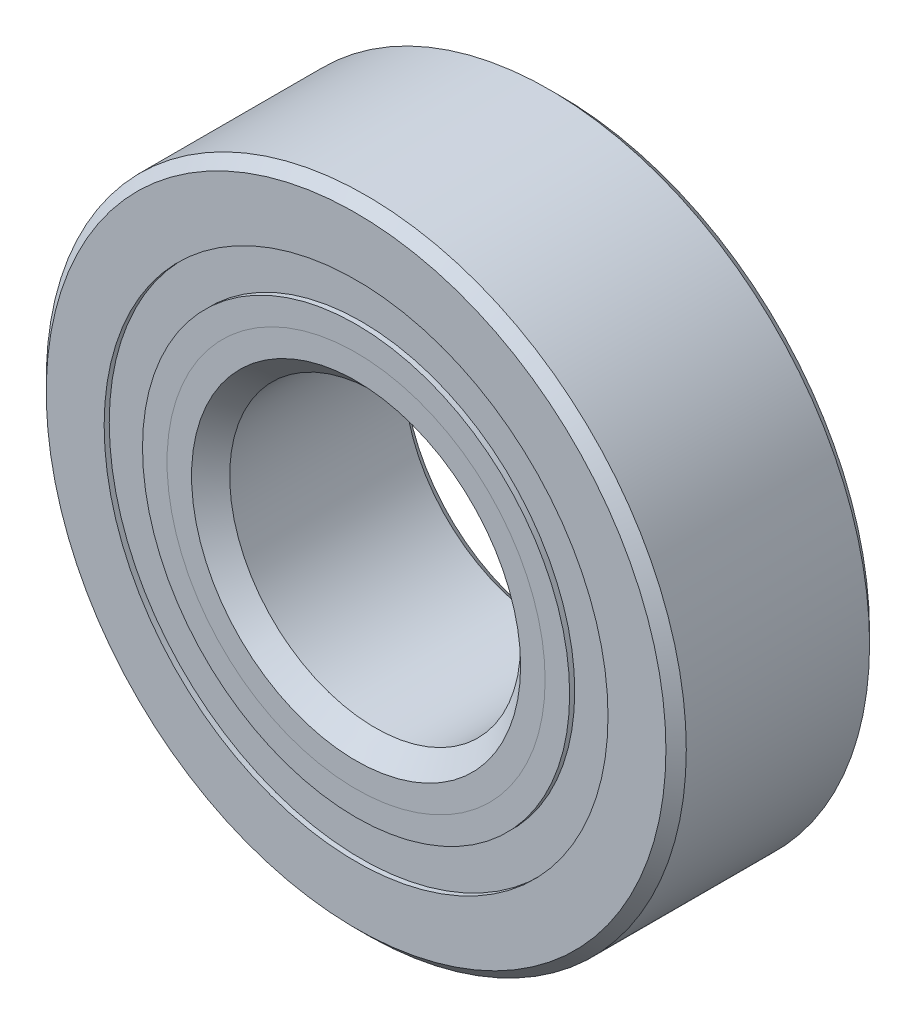
ISO-10303-21;
HEADER;
FILE_DESCRIPTION(('STEP AP214'),'2;1');
FILE_NAME('part.step','',(''),(''),'','','');
FILE_SCHEMA(('AUTOMOTIVE_DESIGN { 1 0 10303 214 1 1 1 1 }'));
ENDSEC;
DATA;
#1=APPLICATION_CONTEXT('core data for automotive mechanical design processes');
#2=APPLICATION_PROTOCOL_DEFINITION('international standard','automotive_design',2000,#1);
#3=PRODUCT_CONTEXT('',#1,'mechanical');
#4=PRODUCT('Part','Part','',(#3));
#5=PRODUCT_RELATED_PRODUCT_CATEGORY('part','',(#4));
#6=PRODUCT_DEFINITION_FORMATION('','',#4);
#7=PRODUCT_DEFINITION_CONTEXT('part definition',#1,'design');
#8=PRODUCT_DEFINITION('design','',#6,#7);
#9=PRODUCT_DEFINITION_SHAPE('','',#8);
#10=(LENGTH_UNIT() NAMED_UNIT(*) SI_UNIT(.MILLI.,.METRE.));
#11=(NAMED_UNIT(*) PLANE_ANGLE_UNIT() SI_UNIT($,.RADIAN.));
#12=(NAMED_UNIT(*) SI_UNIT($,.STERADIAN.) SOLID_ANGLE_UNIT());
#13=UNCERTAINTY_MEASURE_WITH_UNIT(LENGTH_MEASURE(1.E-05),#10,'distance_accuracy_value','');
#14=(GEOMETRIC_REPRESENTATION_CONTEXT(3) GLOBAL_UNCERTAINTY_ASSIGNED_CONTEXT((#13)) GLOBAL_UNIT_ASSIGNED_CONTEXT((#10,
#11,#12)) REPRESENTATION_CONTEXT('',''));
#15=CARTESIAN_POINT('',(0.,0.,0.));
#16=DIRECTION('',(0.,0.,1.));
#17=DIRECTION('',(1.,0.,0.));
#18=AXIS2_PLACEMENT_3D('',#15,#16,#17);
#19=CARTESIAN_POINT('',(0.,13.7467032967033,-5.2784375));
#20=DIRECTION('',(0.,0.,1.));
#21=DIRECTION('',(1.,0.,0.));
#22=AXIS2_PLACEMENT_3D('',#19,#20,#21);
#23=PLANE('',#22);
#24=CARTESIAN_POINT('',(0.,0.,-5.2784375));
#25=DIRECTION('',(0.,0.,1.));
#26=DIRECTION('',(1.,0.,0.));
#27=AXIS2_PLACEMENT_3D('',#24,#25,#26);
#28=CIRCLE('',#27,13.7467032967033);
#29=CARTESIAN_POINT('',(13.7467032967033,0.,-5.2784375));
#30=VERTEX_POINT('',#29);
#31=EDGE_CURVE('E56',#30,#30,#28,.T.);
#32=ORIENTED_EDGE('',*,*,#31,.F.);
#33=EDGE_LOOP('',(#32));
#34=FACE_BOUND('',#33,.T.);
#35=CARTESIAN_POINT('',(0.,0.,-5.2784375));
#36=DIRECTION('',(0.,0.,1.));
#37=DIRECTION('',(1.,0.,0.));
#38=AXIS2_PLACEMENT_3D('',#35,#36,#37);
#39=CIRCLE('',#38,11.6532967032967);
#40=CARTESIAN_POINT('',(11.6532967032967,0.,-5.2784375));
#41=VERTEX_POINT('',#40);
#42=EDGE_CURVE('E11',#41,#41,#39,.T.);
#43=ORIENTED_EDGE('',*,*,#42,.T.);
#44=EDGE_LOOP('',(#43));
#45=FACE_BOUND('',#44,.T.);
#46=ADVANCED_FACE('F42',(#34,#45),#23,.F.);
#47=CARTESIAN_POINT('',(0.,0.,5.55625));
#48=DIRECTION('',(0.,0.,1.));
#49=DIRECTION('',(1.,0.,0.));
#50=AXIS2_PLACEMENT_3D('',#47,#48,#49);
#51=CYLINDRICAL_SURFACE('',#50,11.6532967032967);
#52=ORIENTED_EDGE('',*,*,#42,.F.);
#53=EDGE_LOOP('',(#52));
#54=FACE_BOUND('',#53,.T.);
#55=CARTESIAN_POINT('',(0.,0.,-2.68211551867683));
#56=DIRECTION('',(0.,0.,1.));
#57=DIRECTION('',(1.,0.,0.));
#58=AXIS2_PLACEMENT_3D('',#55,#56,#57);
#59=CIRCLE('',#58,11.6532967032967);
#60=CARTESIAN_POINT('',(11.6532967032967,0.,-2.68211551867683));
#61=VERTEX_POINT('',#60);
#62=EDGE_CURVE('E48',#61,#61,#59,.T.);
#63=ORIENTED_EDGE('',*,*,#62,.T.);
#64=EDGE_LOOP('',(#63));
#65=FACE_BOUND('',#64,.T.);
#66=ADVANCED_FACE('F65',(#54,#65),#51,.F.);
#67=CARTESIAN_POINT('',(0.,13.7467032967033,-2.68211551867683));
#68=DIRECTION('',(0.,0.,-1.));
#69=DIRECTION('',(-1.,0.,0.));
#70=AXIS2_PLACEMENT_3D('',#67,#68,#69);
#71=PLANE('',#70);
#72=ORIENTED_EDGE('',*,*,#62,.F.);
#73=EDGE_LOOP('',(#72));
#74=FACE_BOUND('',#73,.T.);
#75=CARTESIAN_POINT('',(0.,0.,-2.68211551867683));
#76=DIRECTION('',(0.,0.,1.));
#77=DIRECTION('',(1.,0.,0.));
#78=AXIS2_PLACEMENT_3D('',#75,#76,#77);
#79=CIRCLE('',#78,13.7467032967033);
#80=CARTESIAN_POINT('',(13.7467032967033,0.,-2.68211551867683));
#81=VERTEX_POINT('',#80);
#82=EDGE_CURVE('E52',#81,#81,#79,.T.);
#83=ORIENTED_EDGE('',*,*,#82,.T.);
#84=EDGE_LOOP('',(#83));
#85=FACE_BOUND('',#84,.T.);
#86=ADVANCED_FACE('F69',(#74,#85),#71,.F.);
#87=CARTESIAN_POINT('',(0.,0.,5.55625));
#88=DIRECTION('',(0.,0.,1.));
#89=DIRECTION('',(1.,0.,0.));
#90=AXIS2_PLACEMENT_3D('',#87,#88,#89);
#91=CYLINDRICAL_SURFACE('',#90,13.7467032967033);
#92=ORIENTED_EDGE('',*,*,#82,.F.);
#93=EDGE_LOOP('',(#92));
#94=FACE_BOUND('',#93,.T.);
#95=ORIENTED_EDGE('',*,*,#31,.T.);
#96=EDGE_LOOP('',(#95));
#97=FACE_BOUND('',#96,.T.);
#98=ADVANCED_FACE('F62',(#94,#97),#91,.T.);
#99=CLOSED_SHELL('',(#46,#66,#86,#98));
#100=MANIFOLD_SOLID_BREP('B2',#99);
#101=CARTESIAN_POINT('',(0.,13.7467032967033,5.2784375));
#102=DIRECTION('',(0.,0.,-1.));
#103=DIRECTION('',(-1.,0.,0.));
#104=AXIS2_PLACEMENT_3D('',#101,#102,#103);
#105=PLANE('',#104);
#106=CARTESIAN_POINT('',(0.,0.,5.2784375));
#107=DIRECTION('',(0.,0.,1.));
#108=DIRECTION('',(1.,0.,0.));
#109=AXIS2_PLACEMENT_3D('',#106,#107,#108);
#110=CIRCLE('',#109,11.6532967032967);
#111=CARTESIAN_POINT('',(11.6532967032967,0.,5.2784375));
#112=VERTEX_POINT('',#111);
#113=EDGE_CURVE('E41',#112,#112,#110,.T.);
#114=ORIENTED_EDGE('',*,*,#113,.F.);
#115=EDGE_LOOP('',(#114));
#116=FACE_BOUND('',#115,.T.);
#117=CARTESIAN_POINT('',(0.,0.,5.2784375));
#118=DIRECTION('',(0.,0.,1.));
#119=DIRECTION('',(1.,0.,0.));
#120=AXIS2_PLACEMENT_3D('',#117,#118,#119);
#121=CIRCLE('',#120,13.7467032967033);
#122=CARTESIAN_POINT('',(13.7467032967033,0.,5.2784375));
#123=VERTEX_POINT('',#122);
#124=EDGE_CURVE('E124',#123,#123,#121,.T.);
#125=ORIENTED_EDGE('',*,*,#124,.T.);
#126=EDGE_LOOP('',(#125));
#127=FACE_BOUND('',#126,.T.);
#128=ADVANCED_FACE('F110',(#116,#127),#105,.F.);
#129=CARTESIAN_POINT('',(0.,0.,5.55625));
#130=DIRECTION('',(0.,0.,1.));
#131=DIRECTION('',(1.,0.,0.));
#132=AXIS2_PLACEMENT_3D('',#129,#130,#131);
#133=CYLINDRICAL_SURFACE('',#132,11.6532967032967);
#134=CARTESIAN_POINT('',(0.,0.,2.68211551867683));
#135=DIRECTION('',(0.,0.,1.));
#136=DIRECTION('',(1.,0.,0.));
#137=AXIS2_PLACEMENT_3D('',#134,#135,#136);
#138=CIRCLE('',#137,11.6532967032967);
#139=CARTESIAN_POINT('',(11.6532967032967,0.,2.68211551867683));
#140=VERTEX_POINT('',#139);
#141=EDGE_CURVE('E116',#140,#140,#138,.T.);
#142=ORIENTED_EDGE('',*,*,#141,.F.);
#143=EDGE_LOOP('',(#142));
#144=FACE_BOUND('',#143,.T.);
#145=ORIENTED_EDGE('',*,*,#113,.T.);
#146=EDGE_LOOP('',(#145));
#147=FACE_BOUND('',#146,.T.);
#148=ADVANCED_FACE('F139',(#144,#147),#133,.F.);
#149=CARTESIAN_POINT('',(0.,13.7467032967033,2.68211551867683));
#150=DIRECTION('',(0.,0.,1.));
#151=DIRECTION('',(1.,0.,0.));
#152=AXIS2_PLACEMENT_3D('',#149,#150,#151);
#153=PLANE('',#152);
#154=CARTESIAN_POINT('',(0.,0.,2.68211551867683));
#155=DIRECTION('',(0.,0.,1.));
#156=DIRECTION('',(1.,0.,0.));
#157=AXIS2_PLACEMENT_3D('',#154,#155,#156);
#158=CIRCLE('',#157,13.7467032967033);
#159=CARTESIAN_POINT('',(13.7467032967033,0.,2.68211551867683));
#160=VERTEX_POINT('',#159);
#161=EDGE_CURVE('E120',#160,#160,#158,.T.);
#162=ORIENTED_EDGE('',*,*,#161,.F.);
#163=EDGE_LOOP('',(#162));
#164=FACE_BOUND('',#163,.T.);
#165=ORIENTED_EDGE('',*,*,#141,.T.);
#166=EDGE_LOOP('',(#165));
#167=FACE_BOUND('',#166,.T.);
#168=ADVANCED_FACE('F134',(#164,#167),#153,.F.);
#169=CARTESIAN_POINT('',(0.,0.,5.55625));
#170=DIRECTION('',(0.,0.,1.));
#171=DIRECTION('',(1.,0.,0.));
#172=AXIS2_PLACEMENT_3D('',#169,#170,#171);
#173=CYLINDRICAL_SURFACE('',#172,13.7467032967033);
#174=ORIENTED_EDGE('',*,*,#124,.F.);
#175=EDGE_LOOP('',(#174));
#176=FACE_BOUND('',#175,.T.);
#177=ORIENTED_EDGE('',*,*,#161,.T.);
#178=EDGE_LOOP('',(#177));
#179=FACE_BOUND('',#178,.T.);
#180=ADVANCED_FACE('F131',(#176,#179),#173,.T.);
#181=CLOSED_SHELL('',(#128,#148,#168,#180));
#182=MANIFOLD_SOLID_BREP('B6',#181);
#183=CARTESIAN_POINT('',(-6.34999999999986,10.9985226280625,0.));
#184=DIRECTION('',(0.,0.,1.));
#185=DIRECTION('',(-0.499999999999989,0.866025403784445,0.));
#186=AXIS2_PLACEMENT_3D('',#183,#184,#185);
#187=SPHERICAL_SURFACE('',#186,2.68211551867683);
#188=CARTESIAN_POINT('',(-6.34999999999986,10.9985226280625,2.68211551867683));
#189=VERTEX_POINT('',#188);
#190=VERTEX_LOOP('',#189);
#191=FACE_BOUND('',#190,.T.);
#192=ADVANCED_FACE('F179',(#191),#187,.T.);
#193=CLOSED_SHELL('',(#192));
#194=MANIFOLD_SOLID_BREP('B36',#193);
#195=CARTESIAN_POINT('',(-10.9985226280623,6.35000000000013,0.));
#196=DIRECTION('',(0.,0.,1.));
#197=DIRECTION('',(-0.866025403784433,0.50000000000001,0.));
#198=AXIS2_PLACEMENT_3D('',#195,#196,#197);
#199=SPHERICAL_SURFACE('',#198,2.68211551867683);
#200=CARTESIAN_POINT('',(-10.9985226280623,6.35000000000013,2.68211551867683));
#201=VERTEX_POINT('',#200);
#202=VERTEX_LOOP('',#201);
#203=FACE_BOUND('',#202,.T.);
#204=ADVANCED_FACE('F200',(#203),#199,.T.);
#205=CLOSED_SHELL('',(#204));
#206=MANIFOLD_SOLID_BREP('B106',#205);
#207=CARTESIAN_POINT('',(-12.7,1.33025516058267E-13,0.));
#208=DIRECTION('',(0.,0.,1.));
#209=DIRECTION('',(-1.,0.,0.));
#210=AXIS2_PLACEMENT_3D('',#207,#208,#209);
#211=SPHERICAL_SURFACE('',#210,2.68211551867683);
#212=CARTESIAN_POINT('',(-12.7,1.33025516058267E-13,2.68211551867683));
#213=VERTEX_POINT('',#212);
#214=VERTEX_LOOP('',#213);
#215=FACE_BOUND('',#214,.T.);
#216=ADVANCED_FACE('F221',(#215),#211,.T.);
#217=CLOSED_SHELL('',(#216));
#218=MANIFOLD_SOLID_BREP('B175',#217);
#219=CARTESIAN_POINT('',(-10.9985226280624,-6.3499999999999,0.));
#220=DIRECTION('',(0.,0.,1.));
#221=DIRECTION('',(-0.866025403784443,-0.499999999999992,0.));
#222=AXIS2_PLACEMENT_3D('',#219,#220,#221);
#223=SPHERICAL_SURFACE('',#222,2.68211551867683);
#224=CARTESIAN_POINT('',(-10.9985226280624,-6.3499999999999,2.68211551867683));
#225=VERTEX_POINT('',#224);
#226=VERTEX_LOOP('',#225);
#227=FACE_BOUND('',#226,.T.);
#228=ADVANCED_FACE('F242',(#227),#223,.T.);
#229=CLOSED_SHELL('',(#228));
#230=MANIFOLD_SOLID_BREP('B196',#229);
#231=CARTESIAN_POINT('',(-6.35000000000009,-10.9985226280623,0.));
#232=DIRECTION('',(0.,0.,1.));
#233=DIRECTION('',(-0.500000000000007,-0.866025403784435,0.));
#234=AXIS2_PLACEMENT_3D('',#231,#232,#233);
#235=SPHERICAL_SURFACE('',#234,2.68211551867683);
#236=CARTESIAN_POINT('',(-6.35000000000009,-10.9985226280623,2.68211551867683));
#237=VERTEX_POINT('',#236);
#238=VERTEX_LOOP('',#237);
#239=FACE_BOUND('',#238,.T.);
#240=ADVANCED_FACE('F263',(#239),#235,.T.);
#241=CLOSED_SHELL('',(#240));
#242=MANIFOLD_SOLID_BREP('B217',#241);
#243=CARTESIAN_POINT('',(0.,-12.7,0.));
#244=DIRECTION('',(0.,0.,1.));
#245=DIRECTION('',(0.,-1.,0.));
#246=AXIS2_PLACEMENT_3D('',#243,#244,#245);
#247=SPHERICAL_SURFACE('',#246,2.68211551867683);
#248=CARTESIAN_POINT('',(0.,-12.7,2.68211551867683));
#249=VERTEX_POINT('',#248);
#250=VERTEX_LOOP('',#249);
#251=FACE_BOUND('',#250,.T.);
#252=ADVANCED_FACE('F284',(#251),#247,.T.);
#253=CLOSED_SHELL('',(#252));
#254=MANIFOLD_SOLID_BREP('B238',#253);
#255=CARTESIAN_POINT('',(6.34999999999994,-10.9985226280624,0.));
#256=DIRECTION('',(0.,0.,1.));
#257=DIRECTION('',(0.499999999999995,-0.866025403784442,0.));
#258=AXIS2_PLACEMENT_3D('',#255,#256,#257);
#259=SPHERICAL_SURFACE('',#258,2.68211551867683);
#260=CARTESIAN_POINT('',(6.34999999999994,-10.9985226280624,2.68211551867683));
#261=VERTEX_POINT('',#260);
#262=VERTEX_LOOP('',#261);
#263=FACE_BOUND('',#262,.T.);
#264=ADVANCED_FACE('F305',(#263),#259,.T.);
#265=CLOSED_SHELL('',(#264));
#266=MANIFOLD_SOLID_BREP('B259',#265);
#267=CARTESIAN_POINT('',(10.9985226280623,-6.35000000000005,0.));
#268=DIRECTION('',(0.,0.,1.));
#269=DIRECTION('',(0.866025403784436,-0.500000000000004,0.));
#270=AXIS2_PLACEMENT_3D('',#267,#268,#269);
#271=SPHERICAL_SURFACE('',#270,2.68211551867683);
#272=CARTESIAN_POINT('',(10.9985226280623,-6.35000000000005,2.68211551867683));
#273=VERTEX_POINT('',#272);
#274=VERTEX_LOOP('',#273);
#275=FACE_BOUND('',#274,.T.);
#276=ADVANCED_FACE('F326',(#275),#271,.T.);
#277=CLOSED_SHELL('',(#276));
#278=MANIFOLD_SOLID_BREP('B280',#277);
#279=CARTESIAN_POINT('',(12.7,0.,0.));
#280=DIRECTION('',(0.,0.,1.));
#281=DIRECTION('',(1.,0.,0.));
#282=AXIS2_PLACEMENT_3D('',#279,#280,#281);
#283=SPHERICAL_SURFACE('',#282,2.68211551867683);
#284=CARTESIAN_POINT('',(12.7,0.,2.68211551867683));
#285=VERTEX_POINT('',#284);
#286=VERTEX_LOOP('',#285);
#287=FACE_BOUND('',#286,.T.);
#288=ADVANCED_FACE('F347',(#287),#283,.T.);
#289=CLOSED_SHELL('',(#288));
#290=MANIFOLD_SOLID_BREP('B301',#289);
#291=CARTESIAN_POINT('',(10.9985226280624,6.34999999999997,0.));
#292=DIRECTION('',(0.,0.,1.));
#293=DIRECTION('',(0.86602540378444,0.499999999999998,0.));
#294=AXIS2_PLACEMENT_3D('',#291,#292,#293);
#295=SPHERICAL_SURFACE('',#294,2.68211551867683);
#296=CARTESIAN_POINT('',(10.9985226280624,6.34999999999997,2.68211551867683));
#297=VERTEX_POINT('',#296);
#298=VERTEX_LOOP('',#297);
#299=FACE_BOUND('',#298,.T.);
#300=ADVANCED_FACE('F368',(#299),#295,.T.);
#301=CLOSED_SHELL('',(#300));
#302=MANIFOLD_SOLID_BREP('B322',#301);
#303=CARTESIAN_POINT('',(6.35000000000001,10.9985226280624,0.));
#304=DIRECTION('',(0.,0.,1.));
#305=DIRECTION('',(0.500000000000001,0.866025403784438,0.));
#306=AXIS2_PLACEMENT_3D('',#303,#304,#305);
#307=SPHERICAL_SURFACE('',#306,2.68211551867683);
#308=CARTESIAN_POINT('',(6.35000000000001,10.9985226280624,2.68211551867683));
#309=VERTEX_POINT('',#308);
#310=VERTEX_LOOP('',#309);
#311=FACE_BOUND('',#310,.T.);
#312=ADVANCED_FACE('F389',(#311),#307,.T.);
#313=CLOSED_SHELL('',(#312));
#314=MANIFOLD_SOLID_BREP('B343',#313);
#315=CARTESIAN_POINT('',(0.,12.7,0.));
#316=DIRECTION('',(0.,0.,1.));
#317=DIRECTION('',(0.,1.,0.));
#318=AXIS2_PLACEMENT_3D('',#315,#316,#317);
#319=SPHERICAL_SURFACE('',#318,2.68211551867683);
#320=CARTESIAN_POINT('',(0.,12.7,2.68211551867683));
#321=VERTEX_POINT('',#320);
#322=VERTEX_LOOP('',#321);
#323=FACE_BOUND('',#322,.T.);
#324=ADVANCED_FACE('F411',(#323),#319,.T.);
#325=CLOSED_SHELL('',(#324));
#326=MANIFOLD_SOLID_BREP('B364',#325);
#327=CARTESIAN_POINT('',(0.,10.3154944719791,5.55625));
#328=DIRECTION('',(0.,0.,-1.));
#329=DIRECTION('',(-1.,0.,0.));
#330=AXIS2_PLACEMENT_3D('',#327,#328,#329);
#331=PLANE('',#330);
#332=CARTESIAN_POINT('',(0.,0.,5.55625));
#333=DIRECTION('',(0.,0.,1.));
#334=DIRECTION('',(1.,0.,0.));
#335=AXIS2_PLACEMENT_3D('',#332,#333,#334);
#336=CIRCLE('',#335,8.97769224066158);
#337=CARTESIAN_POINT('',(8.97769224066158,0.,5.55625));
#338=VERTEX_POINT('',#337);
#339=EDGE_CURVE('E466',#338,#338,#336,.T.);
#340=ORIENTED_EDGE('',*,*,#339,.F.);
#341=EDGE_LOOP('',(#340));
#342=FACE_BOUND('',#341,.T.);
#343=CARTESIAN_POINT('',(0.,0.,5.55625));
#344=DIRECTION('',(0.,0.,1.));
#345=DIRECTION('',(1.,0.,0.));
#346=AXIS2_PLACEMENT_3D('',#343,#344,#345);
#347=CIRCLE('',#346,10.3154944719791);
#348=CARTESIAN_POINT('',(10.3154944719791,0.,5.55625));
#349=VERTEX_POINT('',#348);
#350=EDGE_CURVE('E410',#349,#349,#347,.T.);
#351=ORIENTED_EDGE('',*,*,#350,.T.);
#352=EDGE_LOOP('',(#351));
#353=FACE_BOUND('',#352,.T.);
#354=ADVANCED_FACE('F432',(#342,#353),#331,.F.);
#355=CARTESIAN_POINT('',(0.,0.,4.21844776868245));
#356=DIRECTION('',(0.,0.,1.));
#357=DIRECTION('',(1.,0.,0.));
#358=AXIS2_PLACEMENT_3D('',#355,#356,#357);
#359=CONICAL_SURFACE('',#358,8.97769224066158,0.78539816339745);
#360=ORIENTED_EDGE('',*,*,#350,.F.);
#361=EDGE_LOOP('',(#360));
#362=FACE_BOUND('',#361,.T.);
#363=CARTESIAN_POINT('',(0.,0.,4.21844776868245));
#364=DIRECTION('',(0.,0.,1.));
#365=DIRECTION('',(1.,0.,0.));
#366=AXIS2_PLACEMENT_3D('',#363,#364,#365);
#367=CIRCLE('',#366,8.97769224066158);
#368=CARTESIAN_POINT('',(8.97769224066158,0.,4.21844776868245));
#369=VERTEX_POINT('',#368);
#370=EDGE_CURVE('E438',#369,#369,#367,.T.);
#371=ORIENTED_EDGE('',*,*,#370,.T.);
#372=EDGE_LOOP('',(#371));
#373=FACE_BOUND('',#372,.T.);
#374=ADVANCED_FACE('F473',(#362,#373),#359,.T.);
#375=CARTESIAN_POINT('',(0.,0.,5.55625));
#376=DIRECTION('',(0.,0.,1.));
#377=DIRECTION('',(1.,0.,0.));
#378=AXIS2_PLACEMENT_3D('',#375,#376,#377);
#379=CYLINDRICAL_SURFACE('',#378,8.97769224066158);
#380=ORIENTED_EDGE('',*,*,#370,.F.);
#381=EDGE_LOOP('',(#380));
#382=FACE_BOUND('',#381,.T.);
#383=CARTESIAN_POINT('',(0.,0.,0.));
#384=DIRECTION('',(0.,0.,1.));
#385=DIRECTION('',(1.,0.,0.));
#386=AXIS2_PLACEMENT_3D('',#383,#384,#385);
#387=CIRCLE('',#386,8.97769224066158);
#388=CARTESIAN_POINT('',(8.97769224066158,0.,0.));
#389=VERTEX_POINT('',#388);
#390=EDGE_CURVE('E442',#389,#389,#387,.T.);
#391=ORIENTED_EDGE('',*,*,#390,.T.);
#392=EDGE_LOOP('',(#391));
#393=FACE_BOUND('',#392,.T.);
#394=ADVANCED_FACE('F477',(#382,#393),#379,.T.);
#395=CARTESIAN_POINT('',(0.,8.97769224066158,0.));
#396=DIRECTION('',(0.,0.,-1.));
#397=DIRECTION('',(-1.,0.,0.));
#398=AXIS2_PLACEMENT_3D('',#395,#396,#397);
#399=PLANE('',#398);
#400=ORIENTED_EDGE('',*,*,#390,.F.);
#401=EDGE_LOOP('',(#400));
#402=FACE_BOUND('',#401,.T.);
#403=CARTESIAN_POINT('',(0.,0.,0.));
#404=DIRECTION('',(0.,0.,1.));
#405=DIRECTION('',(1.,0.,0.));
#406=AXIS2_PLACEMENT_3D('',#403,#404,#405);
#407=CIRCLE('',#406,10.0178844813232);
#408=CARTESIAN_POINT('',(10.0178844813232,0.,0.));
#409=VERTEX_POINT('',#408);
#410=EDGE_CURVE('E446',#409,#409,#407,.T.);
#411=ORIENTED_EDGE('',*,*,#410,.T.);
#412=EDGE_LOOP('',(#411));
#413=FACE_BOUND('',#412,.T.);
#414=ADVANCED_FACE('F482',(#402,#413),#399,.F.);
#415=CARTESIAN_POINT('',(0.,0.,0.));
#416=DIRECTION('',(0.,0.,1.));
#417=DIRECTION('',(1.,0.,0.));
#418=AXIS2_PLACEMENT_3D('',#415,#416,#417);
#419=TOROIDAL_SURFACE('',#418,12.7,2.68211551867683);
#420=ORIENTED_EDGE('',*,*,#410,.F.);
#421=EDGE_LOOP('',(#420));
#422=FACE_BOUND('',#421,.T.);
#423=CARTESIAN_POINT('',(0.,0.,-2.46944444444444));
#424=DIRECTION('',(0.,0.,1.));
#425=DIRECTION('',(1.,0.,0.));
#426=AXIS2_PLACEMENT_3D('',#423,#424,#425);
#427=CIRCLE('',#426,11.6532967032967);
#428=CARTESIAN_POINT('',(11.6532967032967,0.,-2.46944444444444));
#429=VERTEX_POINT('',#428);
#430=EDGE_CURVE('E451',#429,#429,#427,.T.);
#431=ORIENTED_EDGE('',*,*,#430,.T.);
#432=EDGE_LOOP('',(#431));
#433=FACE_BOUND('',#432,.T.);
#434=ADVANCED_FACE('F488',(#422,#433),#419,.F.);
#435=CARTESIAN_POINT('',(0.,0.,5.55625));
#436=DIRECTION('',(0.,0.,1.));
#437=DIRECTION('',(1.,0.,0.));
#438=AXIS2_PLACEMENT_3D('',#435,#436,#437);
#439=CYLINDRICAL_SURFACE('',#438,11.6532967032967);
#440=ORIENTED_EDGE('',*,*,#430,.F.);
#441=EDGE_LOOP('',(#440));
#442=FACE_BOUND('',#441,.T.);
#443=CARTESIAN_POINT('',(0.,0.,-5.55625));
#444=DIRECTION('',(0.,0.,1.));
#445=DIRECTION('',(1.,0.,0.));
#446=AXIS2_PLACEMENT_3D('',#443,#444,#445);
#447=CIRCLE('',#446,11.6532967032967);
#448=CARTESIAN_POINT('',(11.6532967032967,0.,-5.55625));
#449=VERTEX_POINT('',#448);
#450=EDGE_CURVE('E454',#449,#449,#447,.T.);
#451=ORIENTED_EDGE('',*,*,#450,.T.);
#452=EDGE_LOOP('',(#451));
#453=FACE_BOUND('',#452,.T.);
#454=ADVANCED_FACE('F492',(#442,#453),#439,.T.);
#455=CARTESIAN_POINT('',(0.,8.493125,-5.55625));
#456=DIRECTION('',(0.,0.,1.));
#457=DIRECTION('',(1.,0.,0.));
#458=AXIS2_PLACEMENT_3D('',#455,#456,#457);
#459=PLANE('',#458);
#460=ORIENTED_EDGE('',*,*,#450,.F.);
#461=EDGE_LOOP('',(#460));
#462=FACE_BOUND('',#461,.T.);
#463=CARTESIAN_POINT('',(0.,0.,-5.55625));
#464=DIRECTION('',(0.,0.,1.));
#465=DIRECTION('',(1.,0.,0.));
#466=AXIS2_PLACEMENT_3D('',#463,#464,#465);
#467=CIRCLE('',#466,8.493125);
#468=CARTESIAN_POINT('',(8.493125,0.,-5.55625));
#469=VERTEX_POINT('',#468);
#470=EDGE_CURVE('E457',#469,#469,#467,.T.);
#471=ORIENTED_EDGE('',*,*,#470,.T.);
#472=EDGE_LOOP('',(#471));
#473=FACE_BOUND('',#472,.T.);
#474=ADVANCED_FACE('F496',(#462,#473),#459,.F.);
#475=CARTESIAN_POINT('',(0.,0.,-5.000625));
#476=DIRECTION('',(0.,0.,-1.));
#477=DIRECTION('',(-1.,0.,0.));
#478=AXIS2_PLACEMENT_3D('',#475,#476,#477);
#479=CONICAL_SURFACE('',#478,7.9375,0.785398163397447);
#480=ORIENTED_EDGE('',*,*,#470,.F.);
#481=EDGE_LOOP('',(#480));
#482=FACE_BOUND('',#481,.T.);
#483=CARTESIAN_POINT('',(0.,0.,-5.000625));
#484=DIRECTION('',(0.,0.,1.));
#485=DIRECTION('',(1.,0.,0.));
#486=AXIS2_PLACEMENT_3D('',#483,#484,#485);
#487=CIRCLE('',#486,7.9375);
#488=CARTESIAN_POINT('',(7.9375,0.,-5.000625));
#489=VERTEX_POINT('',#488);
#490=EDGE_CURVE('E460',#489,#489,#487,.T.);
#491=ORIENTED_EDGE('',*,*,#490,.T.);
#492=EDGE_LOOP('',(#491));
#493=FACE_BOUND('',#492,.T.);
#494=ADVANCED_FACE('F500',(#482,#493),#479,.F.);
#495=CARTESIAN_POINT('',(0.,0.,5.55625));
#496=DIRECTION('',(0.,0.,1.));
#497=DIRECTION('',(1.,0.,0.));
#498=AXIS2_PLACEMENT_3D('',#495,#496,#497);
#499=CYLINDRICAL_SURFACE('',#498,7.9375);
#500=ORIENTED_EDGE('',*,*,#490,.F.);
#501=EDGE_LOOP('',(#500));
#502=FACE_BOUND('',#501,.T.);
#503=CARTESIAN_POINT('',(0.,0.,4.51605775933842));
#504=DIRECTION('',(0.,0.,1.));
#505=DIRECTION('',(1.,0.,0.));
#506=AXIS2_PLACEMENT_3D('',#503,#504,#505);
#507=CIRCLE('',#506,7.9375);
#508=CARTESIAN_POINT('',(7.9375,0.,4.51605775933842));
#509=VERTEX_POINT('',#508);
#510=EDGE_CURVE('E463',#509,#509,#507,.T.);
#511=ORIENTED_EDGE('',*,*,#510,.T.);
#512=EDGE_LOOP('',(#511));
#513=FACE_BOUND('',#512,.T.);
#514=ADVANCED_FACE('F504',(#502,#513),#499,.F.);
#515=CARTESIAN_POINT('',(0.,0.,5.55625));
#516=DIRECTION('',(0.,0.,1.));
#517=DIRECTION('',(1.,0.,0.));
#518=AXIS2_PLACEMENT_3D('',#515,#516,#517);
#519=CONICAL_SURFACE('',#518,8.97769224066158,0.785398163397451);
#520=ORIENTED_EDGE('',*,*,#510,.F.);
#521=EDGE_LOOP('',(#520));
#522=FACE_BOUND('',#521,.T.);
#523=ORIENTED_EDGE('',*,*,#339,.T.);
#524=EDGE_LOOP('',(#523));
#525=FACE_BOUND('',#524,.T.);
#526=ADVANCED_FACE('F470',(#522,#525),#519,.F.);
#527=CLOSED_SHELL('',(#354,#374,#394,#414,#434,#454,#474,#494,#514,#526));
#528=MANIFOLD_SOLID_BREP('B385',#527);
#529=CARTESIAN_POINT('',(0.,11.6532967032967,5.55625));
#530=DIRECTION('',(0.,0.,-1.));
#531=DIRECTION('',(-1.,0.,0.));
#532=AXIS2_PLACEMENT_3D('',#529,#530,#531);
#533=PLANE('',#532);
#534=CARTESIAN_POINT('',(0.,0.,5.55625));
#535=DIRECTION('',(0.,0.,1.));
#536=DIRECTION('',(1.,0.,0.));
#537=AXIS2_PLACEMENT_3D('',#534,#535,#536);
#538=CIRCLE('',#537,10.3154944719791);
#539=CARTESIAN_POINT('',(10.3154944719791,0.,5.55625));
#540=VERTEX_POINT('',#539);
#541=EDGE_CURVE('E431',#540,#540,#538,.T.);
#542=ORIENTED_EDGE('',*,*,#541,.F.);
#543=EDGE_LOOP('',(#542));
#544=FACE_BOUND('',#543,.T.);
#545=CARTESIAN_POINT('',(0.,0.,5.55625));
#546=DIRECTION('',(0.,0.,1.));
#547=DIRECTION('',(1.,0.,0.));
#548=AXIS2_PLACEMENT_3D('',#545,#546,#547);
#549=CIRCLE('',#548,11.6532967032967);
#550=CARTESIAN_POINT('',(11.6532967032967,0.,5.55625));
#551=VERTEX_POINT('',#550);
#552=EDGE_CURVE('E613',#551,#551,#549,.T.);
#553=ORIENTED_EDGE('',*,*,#552,.T.);
#554=EDGE_LOOP('',(#553));
#555=FACE_BOUND('',#554,.T.);
#556=ADVANCED_FACE('F591',(#544,#555),#533,.F.);
#557=CARTESIAN_POINT('',(0.,0.,5.55625));
#558=DIRECTION('',(0.,0.,1.));
#559=DIRECTION('',(1.,0.,0.));
#560=AXIS2_PLACEMENT_3D('',#557,#558,#559);
#561=CONICAL_SURFACE('',#560,10.3154944719791,0.78539816339745);
#562=CARTESIAN_POINT('',(0.,0.,4.21844776868245));
#563=DIRECTION('',(0.,0.,1.));
#564=DIRECTION('',(1.,0.,0.));
#565=AXIS2_PLACEMENT_3D('',#562,#563,#564);
#566=CIRCLE('',#565,8.97769224066158);
#567=CARTESIAN_POINT('',(8.97769224066158,0.,4.21844776868245));
#568=VERTEX_POINT('',#567);
#569=EDGE_CURVE('E597',#568,#568,#566,.T.);
#570=ORIENTED_EDGE('',*,*,#569,.F.);
#571=EDGE_LOOP('',(#570));
#572=FACE_BOUND('',#571,.T.);
#573=ORIENTED_EDGE('',*,*,#541,.T.);
#574=EDGE_LOOP('',(#573));
#575=FACE_BOUND('',#574,.T.);
#576=ADVANCED_FACE('F638',(#572,#575),#561,.F.);
#577=CARTESIAN_POINT('',(0.,0.,5.55625));
#578=DIRECTION('',(0.,0.,1.));
#579=DIRECTION('',(1.,0.,0.));
#580=AXIS2_PLACEMENT_3D('',#577,#578,#579);
#581=CYLINDRICAL_SURFACE('',#580,8.97769224066158);
#582=CARTESIAN_POINT('',(0.,0.,0.));
#583=DIRECTION('',(0.,0.,1.));
#584=DIRECTION('',(1.,0.,0.));
#585=AXIS2_PLACEMENT_3D('',#582,#583,#584);
#586=CIRCLE('',#585,8.97769224066158);
#587=CARTESIAN_POINT('',(8.97769224066158,0.,0.));
#588=VERTEX_POINT('',#587);
#589=EDGE_CURVE('E601',#588,#588,#586,.T.);
#590=ORIENTED_EDGE('',*,*,#589,.F.);
#591=EDGE_LOOP('',(#590));
#592=FACE_BOUND('',#591,.T.);
#593=ORIENTED_EDGE('',*,*,#569,.T.);
#594=EDGE_LOOP('',(#593));
#595=FACE_BOUND('',#594,.T.);
#596=ADVANCED_FACE('F633',(#592,#595),#581,.F.);
#597=CARTESIAN_POINT('',(0.,8.97769224066158,0.));
#598=DIRECTION('',(0.,0.,1.));
#599=DIRECTION('',(1.,0.,0.));
#600=AXIS2_PLACEMENT_3D('',#597,#598,#599);
#601=PLANE('',#600);
#602=CARTESIAN_POINT('',(0.,0.,0.));
#603=DIRECTION('',(0.,0.,1.));
#604=DIRECTION('',(1.,0.,0.));
#605=AXIS2_PLACEMENT_3D('',#602,#603,#604);
#606=CIRCLE('',#605,10.0178844813232);
#607=CARTESIAN_POINT('',(10.0178844813232,0.,0.));
#608=VERTEX_POINT('',#607);
#609=EDGE_CURVE('E605',#608,#608,#606,.T.);
#610=ORIENTED_EDGE('',*,*,#609,.F.);
#611=EDGE_LOOP('',(#610));
#612=FACE_BOUND('',#611,.T.);
#613=ORIENTED_EDGE('',*,*,#589,.T.);
#614=EDGE_LOOP('',(#613));
#615=FACE_BOUND('',#614,.T.);
#616=ADVANCED_FACE('F627',(#612,#615),#601,.F.);
#617=CARTESIAN_POINT('',(0.,0.,0.));
#618=DIRECTION('',(0.,0.,1.));
#619=DIRECTION('',(1.,0.,0.));
#620=AXIS2_PLACEMENT_3D('',#617,#618,#619);
#621=TOROIDAL_SURFACE('',#620,12.7,2.68211551867683);
#622=CARTESIAN_POINT('',(0.,0.,2.46944444444444));
#623=DIRECTION('',(0.,0.,1.));
#624=DIRECTION('',(1.,0.,0.));
#625=AXIS2_PLACEMENT_3D('',#622,#623,#624);
#626=CIRCLE('',#625,11.6532967032967);
#627=CARTESIAN_POINT('',(11.6532967032967,0.,2.46944444444444));
#628=VERTEX_POINT('',#627);
#629=EDGE_CURVE('E610',#628,#628,#626,.T.);
#630=ORIENTED_EDGE('',*,*,#629,.F.);
#631=EDGE_LOOP('',(#630));
#632=FACE_BOUND('',#631,.T.);
#633=ORIENTED_EDGE('',*,*,#609,.T.);
#634=EDGE_LOOP('',(#633));
#635=FACE_BOUND('',#634,.T.);
#636=ADVANCED_FACE('F621',(#632,#635),#621,.F.);
#637=CARTESIAN_POINT('',(0.,0.,5.55625));
#638=DIRECTION('',(0.,0.,1.));
#639=DIRECTION('',(1.,0.,0.));
#640=AXIS2_PLACEMENT_3D('',#637,#638,#639);
#641=CYLINDRICAL_SURFACE('',#640,11.6532967032967);
#642=ORIENTED_EDGE('',*,*,#552,.F.);
#643=EDGE_LOOP('',(#642));
#644=FACE_BOUND('',#643,.T.);
#645=ORIENTED_EDGE('',*,*,#629,.T.);
#646=EDGE_LOOP('',(#645));
#647=FACE_BOUND('',#646,.T.);
#648=ADVANCED_FACE('F618',(#644,#647),#641,.T.);
#649=CLOSED_SHELL('',(#556,#576,#596,#616,#636,#648));
#650=MANIFOLD_SOLID_BREP('B405',#649);
#651=CARTESIAN_POINT('',(0.,0.,5.000625));
#652=DIRECTION('',(0.,0.,-1.));
#653=DIRECTION('',(-1.,0.,0.));
#654=AXIS2_PLACEMENT_3D('',#651,#652,#653);
#655=CONICAL_SURFACE('',#654,17.4625,0.785398163397446);
#656=CARTESIAN_POINT('',(0.,0.,5.55625));
#657=DIRECTION('',(0.,0.,1.));
#658=DIRECTION('',(1.,0.,0.));
#659=AXIS2_PLACEMENT_3D('',#656,#657,#658);
#660=CIRCLE('',#659,16.906875);
#661=CARTESIAN_POINT('',(16.906875,0.,5.55625));
#662=VERTEX_POINT('',#661);
#663=EDGE_CURVE('E711',#662,#662,#660,.T.);
#664=ORIENTED_EDGE('',*,*,#663,.F.);
#665=EDGE_LOOP('',(#664));
#666=FACE_BOUND('',#665,.T.);
#667=CARTESIAN_POINT('',(0.,0.,5.000625));
#668=DIRECTION('',(0.,0.,1.));
#669=DIRECTION('',(1.,0.,0.));
#670=AXIS2_PLACEMENT_3D('',#667,#668,#669);
#671=CIRCLE('',#670,17.4625);
#672=CARTESIAN_POINT('',(17.4625,0.,5.000625));
#673=VERTEX_POINT('',#672);
#674=EDGE_CURVE('E590',#673,#673,#671,.T.);
#675=ORIENTED_EDGE('',*,*,#674,.T.);
#676=EDGE_LOOP('',(#675));
#677=FACE_BOUND('',#676,.T.);
#678=ADVANCED_FACE('F683',(#666,#677),#655,.T.);
#679=CARTESIAN_POINT('',(0.,0.,5.55625));
#680=DIRECTION('',(0.,0.,1.));
#681=DIRECTION('',(1.,0.,0.));
#682=AXIS2_PLACEMENT_3D('',#679,#680,#681);
#683=CYLINDRICAL_SURFACE('',#682,17.4625);
#684=ORIENTED_EDGE('',*,*,#674,.F.);
#685=EDGE_LOOP('',(#684));
#686=FACE_BOUND('',#685,.T.);
#687=CARTESIAN_POINT('',(0.,0.,-5.000625));
#688=DIRECTION('',(0.,0.,1.));
#689=DIRECTION('',(1.,0.,0.));
#690=AXIS2_PLACEMENT_3D('',#687,#688,#689);
#691=CIRCLE('',#690,17.4625);
#692=CARTESIAN_POINT('',(17.4625,0.,-5.000625));
#693=VERTEX_POINT('',#692);
#694=EDGE_CURVE('E689',#693,#693,#691,.T.);
#695=ORIENTED_EDGE('',*,*,#694,.T.);
#696=EDGE_LOOP('',(#695));
#697=FACE_BOUND('',#696,.T.);
#698=ADVANCED_FACE('F718',(#686,#697),#683,.T.);
#699=CARTESIAN_POINT('',(0.,0.,-5.55625));
#700=DIRECTION('',(0.,0.,1.));
#701=DIRECTION('',(1.,0.,0.));
#702=AXIS2_PLACEMENT_3D('',#699,#700,#701);
#703=CONICAL_SURFACE('',#702,16.906875,0.785398163397444);
#704=ORIENTED_EDGE('',*,*,#694,.F.);
#705=EDGE_LOOP('',(#704));
#706=FACE_BOUND('',#705,.T.);
#707=CARTESIAN_POINT('',(0.,0.,-5.55625));
#708=DIRECTION('',(0.,0.,1.));
#709=DIRECTION('',(1.,0.,0.));
#710=AXIS2_PLACEMENT_3D('',#707,#708,#709);
#711=CIRCLE('',#710,16.906875);
#712=CARTESIAN_POINT('',(16.906875,0.,-5.55625));
#713=VERTEX_POINT('',#712);
#714=EDGE_CURVE('E693',#713,#713,#711,.T.);
#715=ORIENTED_EDGE('',*,*,#714,.T.);
#716=EDGE_LOOP('',(#715));
#717=FACE_BOUND('',#716,.T.);
#718=ADVANCED_FACE('F722',(#706,#717),#703,.T.);
#719=CARTESIAN_POINT('',(0.,16.906875,-5.55625));
#720=DIRECTION('',(0.,0.,1.));
#721=DIRECTION('',(1.,0.,0.));
#722=AXIS2_PLACEMENT_3D('',#719,#720,#721);
#723=PLANE('',#722);
#724=ORIENTED_EDGE('',*,*,#714,.F.);
#725=EDGE_LOOP('',(#724));
#726=FACE_BOUND('',#725,.T.);
#727=CARTESIAN_POINT('',(0.,0.,-5.55625));
#728=DIRECTION('',(0.,0.,1.));
#729=DIRECTION('',(1.,0.,0.));
#730=AXIS2_PLACEMENT_3D('',#727,#728,#729);
#731=CIRCLE('',#730,13.7467032967033);
#732=CARTESIAN_POINT('',(13.7467032967033,0.,-5.55625));
#733=VERTEX_POINT('',#732);
#734=EDGE_CURVE('E697',#733,#733,#731,.T.);
#735=ORIENTED_EDGE('',*,*,#734,.T.);
#736=EDGE_LOOP('',(#735));
#737=FACE_BOUND('',#736,.T.);
#738=ADVANCED_FACE('F727',(#726,#737),#723,.F.);
#739=CARTESIAN_POINT('',(0.,0.,5.55625));
#740=DIRECTION('',(0.,0.,1.));
#741=DIRECTION('',(1.,0.,0.));
#742=AXIS2_PLACEMENT_3D('',#739,#740,#741);
#743=CYLINDRICAL_SURFACE('',#742,13.7467032967033);
#744=ORIENTED_EDGE('',*,*,#734,.F.);
#745=EDGE_LOOP('',(#744));
#746=FACE_BOUND('',#745,.T.);
#747=CARTESIAN_POINT('',(0.,0.,-2.46944444444444));
#748=DIRECTION('',(0.,0.,1.));
#749=DIRECTION('',(1.,0.,0.));
#750=AXIS2_PLACEMENT_3D('',#747,#748,#749);
#751=CIRCLE('',#750,13.7467032967033);
#752=CARTESIAN_POINT('',(13.7467032967033,0.,-2.46944444444444));
#753=VERTEX_POINT('',#752);
#754=EDGE_CURVE('E702',#753,#753,#751,.T.);
#755=ORIENTED_EDGE('',*,*,#754,.T.);
#756=EDGE_LOOP('',(#755));
#757=FACE_BOUND('',#756,.T.);
#758=ADVANCED_FACE('F733',(#746,#757),#743,.F.);
#759=CARTESIAN_POINT('',(0.,0.,0.));
#760=DIRECTION('',(0.,0.,1.));
#761=DIRECTION('',(1.,0.,0.));
#762=AXIS2_PLACEMENT_3D('',#759,#760,#761);
#763=TOROIDAL_SURFACE('',#762,12.7,2.68211551867683);
#764=ORIENTED_EDGE('',*,*,#754,.F.);
#765=EDGE_LOOP('',(#764));
#766=FACE_BOUND('',#765,.T.);
#767=CARTESIAN_POINT('',(0.,0.,2.46944444444444));
#768=DIRECTION('',(0.,0.,1.));
#769=DIRECTION('',(1.,0.,0.));
#770=AXIS2_PLACEMENT_3D('',#767,#768,#769);
#771=CIRCLE('',#770,13.7467032967033);
#772=CARTESIAN_POINT('',(13.7467032967033,0.,2.46944444444444));
#773=VERTEX_POINT('',#772);
#774=EDGE_CURVE('E705',#773,#773,#771,.T.);
#775=ORIENTED_EDGE('',*,*,#774,.T.);
#776=EDGE_LOOP('',(#775));
#777=FACE_BOUND('',#776,.T.);
#778=ADVANCED_FACE('F737',(#766,#777),#763,.F.);
#779=CARTESIAN_POINT('',(0.,0.,5.55625));
#780=DIRECTION('',(0.,0.,1.));
#781=DIRECTION('',(1.,0.,0.));
#782=AXIS2_PLACEMENT_3D('',#779,#780,#781);
#783=CYLINDRICAL_SURFACE('',#782,13.7467032967033);
#784=ORIENTED_EDGE('',*,*,#774,.F.);
#785=EDGE_LOOP('',(#784));
#786=FACE_BOUND('',#785,.T.);
#787=CARTESIAN_POINT('',(0.,0.,5.55625));
#788=DIRECTION('',(0.,0.,1.));
#789=DIRECTION('',(1.,0.,0.));
#790=AXIS2_PLACEMENT_3D('',#787,#788,#789);
#791=CIRCLE('',#790,13.7467032967033);
#792=CARTESIAN_POINT('',(13.7467032967033,0.,5.55625));
#793=VERTEX_POINT('',#792);
#794=EDGE_CURVE('E708',#793,#793,#791,.T.);
#795=ORIENTED_EDGE('',*,*,#794,.T.);
#796=EDGE_LOOP('',(#795));
#797=FACE_BOUND('',#796,.T.);
#798=ADVANCED_FACE('F741',(#786,#797),#783,.F.);
#799=CARTESIAN_POINT('',(0.,16.906875,5.55625));
#800=DIRECTION('',(0.,0.,-1.));
#801=DIRECTION('',(-1.,0.,0.));
#802=AXIS2_PLACEMENT_3D('',#799,#800,#801);
#803=PLANE('',#802);
#804=ORIENTED_EDGE('',*,*,#794,.F.);
#805=EDGE_LOOP('',(#804));
#806=FACE_BOUND('',#805,.T.);
#807=ORIENTED_EDGE('',*,*,#663,.T.);
#808=EDGE_LOOP('',(#807));
#809=FACE_BOUND('',#808,.T.);
#810=ADVANCED_FACE('F715',(#806,#809),#803,.F.);
#811=CLOSED_SHELL('',(#678,#698,#718,#738,#758,#778,#798,#810));
#812=MANIFOLD_SOLID_BREP('B426',#811);
#813=ADVANCED_BREP_SHAPE_REPRESENTATION('',(#18,#100,#182,#194,#206,#218,#230,#242,#254,#266,
#278,#290,#302,#314,#326,#528,#650,#812),#14);
#814=SHAPE_DEFINITION_REPRESENTATION(#9,#813);
ENDSEC;
END-ISO-10303-21;
